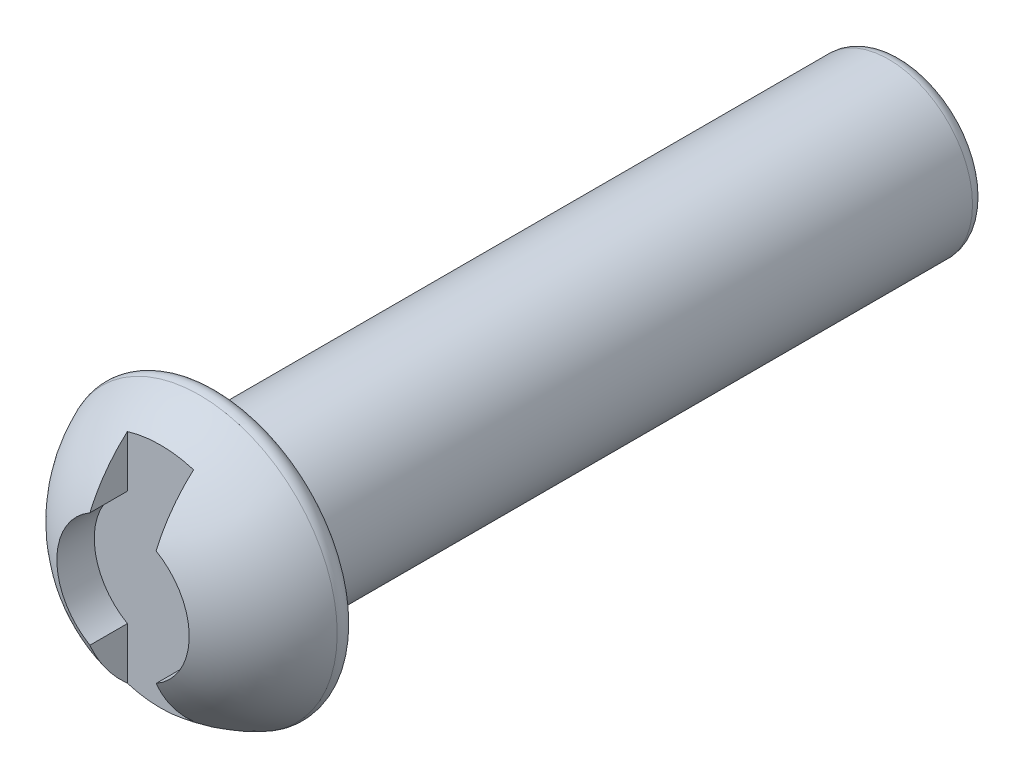
ISO-10303-21;
HEADER;
FILE_DESCRIPTION(('STEP AP214'),'2;1');
FILE_NAME('part.step','',(''),(''),'','','');
FILE_SCHEMA(('AUTOMOTIVE_DESIGN { 1 0 10303 214 1 1 1 1 }'));
ENDSEC;
DATA;
#1=APPLICATION_CONTEXT('core data for automotive mechanical design processes');
#2=APPLICATION_PROTOCOL_DEFINITION('international standard','automotive_design',2000,#1);
#3=PRODUCT_CONTEXT('',#1,'mechanical');
#4=PRODUCT('Part','Part','',(#3));
#5=PRODUCT_RELATED_PRODUCT_CATEGORY('part','',(#4));
#6=PRODUCT_DEFINITION_FORMATION('','',#4);
#7=PRODUCT_DEFINITION_CONTEXT('part definition',#1,'design');
#8=PRODUCT_DEFINITION('design','',#6,#7);
#9=PRODUCT_DEFINITION_SHAPE('','',#8);
#10=(LENGTH_UNIT() NAMED_UNIT(*) SI_UNIT(.MILLI.,.METRE.));
#11=(NAMED_UNIT(*) PLANE_ANGLE_UNIT() SI_UNIT($,.RADIAN.));
#12=(NAMED_UNIT(*) SI_UNIT($,.STERADIAN.) SOLID_ANGLE_UNIT());
#13=UNCERTAINTY_MEASURE_WITH_UNIT(LENGTH_MEASURE(1.E-05),#10,'distance_accuracy_value','');
#14=(GEOMETRIC_REPRESENTATION_CONTEXT(3) GLOBAL_UNCERTAINTY_ASSIGNED_CONTEXT((#13)) GLOBAL_UNIT_ASSIGNED_CONTEXT((#10,
#11,#12)) REPRESENTATION_CONTEXT('',''));
#15=CARTESIAN_POINT('',(0.,0.,0.));
#16=DIRECTION('',(0.,0.,1.));
#17=DIRECTION('',(1.,0.,0.));
#18=AXIS2_PLACEMENT_3D('',#15,#16,#17);
#19=CARTESIAN_POINT('',(0.,0.,-1.68776));
#20=DIRECTION('',(0.,0.,1.));
#21=DIRECTION('',(0.,1.,0.));
#22=AXIS2_PLACEMENT_3D('',#19,#20,#21);
#23=SPHERICAL_SURFACE('',#22,1.68776);
#24=CARTESIAN_POINT('',(0.,0.,-1.04266725626886));
#25=DIRECTION('',(0.,0.,-1.));
#26=DIRECTION('',(-1.,0.,0.));
#27=AXIS2_PLACEMENT_3D('',#24,#25,#26);
#28=CIRCLE('',#27,1.55961186504381);
#29=CARTESIAN_POINT('',(-1.55961186504381,0.,-1.04266725626886));
#30=VERTEX_POINT('',#29);
#31=EDGE_CURVE('E145',#30,#30,#28,.F.);
#32=ORIENTED_EDGE('',*,*,#31,.T.);
#33=EDGE_LOOP('',(#32));
#34=FACE_BOUND('',#33,.T.);
#35=CARTESIAN_POINT('',(-0.375,0.,-1.68776));
#36=DIRECTION('',(-1.,0.,0.));
#37=DIRECTION('',(0.,-1.,0.));
#38=AXIS2_PLACEMENT_3D('',#35,#36,#37);
#39=CIRCLE('',#38,1.64557248931793);
#40=CARTESIAN_POINT('',(-0.375,-1.2347821670238,-0.6));
#41=VERTEX_POINT('',#40);
#42=CARTESIAN_POINT('',(-0.375,-0.649519052838329,-0.175796436417861));
#43=VERTEX_POINT('',#42);
#44=EDGE_CURVE('E138',#41,#43,#39,.T.);
#45=ORIENTED_EDGE('',*,*,#44,.T.);
#46=CARTESIAN_POINT('',(0.,0.,-0.175796436417861));
#47=DIRECTION('',(0.,0.,-1.));
#48=DIRECTION('',(-1.,0.,0.));
#49=AXIS2_PLACEMENT_3D('',#46,#47,#48);
#50=CIRCLE('',#49,0.75);
#51=CARTESIAN_POINT('',(-0.375,0.64951905283833,-0.175796436417862));
#52=VERTEX_POINT('',#51);
#53=EDGE_CURVE('E60',#43,#52,#50,.T.);
#54=ORIENTED_EDGE('',*,*,#53,.T.);
#55=CARTESIAN_POINT('',(-0.375,0.,-1.68776));
#56=DIRECTION('',(-1.,0.,0.));
#57=DIRECTION('',(0.,-1.,0.));
#58=AXIS2_PLACEMENT_3D('',#55,#56,#57);
#59=CIRCLE('',#58,1.64557248931793);
#60=CARTESIAN_POINT('',(-0.375,1.2347821670238,-0.6));
#61=VERTEX_POINT('',#60);
#62=EDGE_CURVE('E141',#52,#61,#59,.T.);
#63=ORIENTED_EDGE('',*,*,#62,.T.);
#64=CARTESIAN_POINT('',(0.,0.,-0.6));
#65=DIRECTION('',(0.,0.,1.));
#66=DIRECTION('',(1.,0.,0.));
#67=AXIS2_PLACEMENT_3D('',#64,#65,#66);
#68=CIRCLE('',#67,1.29046968193755);
#69=CARTESIAN_POINT('',(0.375,1.2347821670238,-0.6));
#70=VERTEX_POINT('',#69);
#71=EDGE_CURVE('E131',#70,#61,#68,.T.);
#72=ORIENTED_EDGE('',*,*,#71,.F.);
#73=CARTESIAN_POINT('',(0.375,0.,-1.68776));
#74=DIRECTION('',(1.,0.,0.));
#75=DIRECTION('',(0.,1.,0.));
#76=AXIS2_PLACEMENT_3D('',#73,#74,#75);
#77=CIRCLE('',#76,1.64557248931793);
#78=CARTESIAN_POINT('',(0.375,0.64951905283833,-0.175796436417861));
#79=VERTEX_POINT('',#78);
#80=EDGE_CURVE('E135',#70,#79,#77,.T.);
#81=ORIENTED_EDGE('',*,*,#80,.T.);
#82=CARTESIAN_POINT('',(0.,0.,-0.175796436417861));
#83=DIRECTION('',(0.,0.,-1.));
#84=DIRECTION('',(-1.,0.,0.));
#85=AXIS2_PLACEMENT_3D('',#82,#83,#84);
#86=CIRCLE('',#85,0.75);
#87=CARTESIAN_POINT('',(0.375,-0.649519052838329,-0.175796436417861));
#88=VERTEX_POINT('',#87);
#89=EDGE_CURVE('E133',#79,#88,#86,.T.);
#90=ORIENTED_EDGE('',*,*,#89,.T.);
#91=CARTESIAN_POINT('',(0.375,0.,-1.68776));
#92=DIRECTION('',(1.,0.,0.));
#93=DIRECTION('',(0.,1.,0.));
#94=AXIS2_PLACEMENT_3D('',#91,#92,#93);
#95=CIRCLE('',#94,1.64557248931793);
#96=CARTESIAN_POINT('',(0.375,-1.2347821670238,-0.6));
#97=VERTEX_POINT('',#96);
#98=EDGE_CURVE('E105',#88,#97,#95,.T.);
#99=ORIENTED_EDGE('',*,*,#98,.T.);
#100=EDGE_CURVE('E98',#41,#97,#68,.T.);
#101=ORIENTED_EDGE('',*,*,#100,.F.);
#102=EDGE_LOOP('',(#45,#54,#63,#72,#81,#90,#99,#101));
#103=FACE_BOUND('',#102,.T.);
#104=ADVANCED_FACE('F37',(#34,#103),#23,.T.);
#105=CARTESIAN_POINT('',(0.,0.,-9.));
#106=DIRECTION('',(0.,0.,1.));
#107=DIRECTION('',(1.,0.,0.));
#108=AXIS2_PLACEMENT_3D('',#105,#106,#107);
#109=PLANE('',#108);
#110=CARTESIAN_POINT('',(0.,0.,-9.));
#111=DIRECTION('',(0.,0.,1.));
#112=DIRECTION('',(1.,0.,0.));
#113=AXIS2_PLACEMENT_3D('',#110,#111,#112);
#114=CIRCLE('',#113,0.799999999999999);
#115=CARTESIAN_POINT('',(0.799999999999999,0.,-9.));
#116=VERTEX_POINT('',#115);
#117=EDGE_CURVE('E11',#116,#116,#114,.F.);
#118=ORIENTED_EDGE('',*,*,#117,.T.);
#119=EDGE_LOOP('',(#118));
#120=FACE_BOUND('',#119,.T.);
#121=ADVANCED_FACE('F165',(#120),#109,.F.);
#122=CARTESIAN_POINT('',(0.,0.,0.));
#123=DIRECTION('',(0.,0.,1.));
#124=DIRECTION('',(1.,0.,0.));
#125=AXIS2_PLACEMENT_3D('',#122,#123,#124);
#126=CYLINDRICAL_SURFACE('',#125,0.949999999999999);
#127=CARTESIAN_POINT('',(0.,0.,-8.85));
#128=DIRECTION('',(0.,0.,1.));
#129=DIRECTION('',(1.,0.,0.));
#130=AXIS2_PLACEMENT_3D('',#127,#128,#129);
#131=CIRCLE('',#130,0.949999999999999);
#132=CARTESIAN_POINT('',(0.949999999999999,0.,-8.85));
#133=VERTEX_POINT('',#132);
#134=EDGE_CURVE('E45',#133,#133,#131,.T.);
#135=ORIENTED_EDGE('',*,*,#134,.T.);
#136=EDGE_LOOP('',(#135));
#137=FACE_BOUND('',#136,.T.);
#138=CARTESIAN_POINT('',(0.,0.,-1.25));
#139=DIRECTION('',(0.,0.,1.));
#140=DIRECTION('',(1.,0.,0.));
#141=AXIS2_PLACEMENT_3D('',#138,#139,#140);
#142=CIRCLE('',#141,0.949999999999999);
#143=CARTESIAN_POINT('',(0.949999999999999,0.,-1.25));
#144=VERTEX_POINT('',#143);
#145=EDGE_CURVE('E124',#144,#144,#142,.T.);
#146=ORIENTED_EDGE('',*,*,#145,.F.);
#147=EDGE_LOOP('',(#146));
#148=FACE_BOUND('',#147,.T.);
#149=ADVANCED_FACE('F153',(#137,#148),#126,.T.);
#150=CARTESIAN_POINT('',(0.,1.63,-1.25));
#151=DIRECTION('',(0.,0.,1.));
#152=DIRECTION('',(1.,0.,0.));
#153=AXIS2_PLACEMENT_3D('',#150,#151,#152);
#154=PLANE('',#153);
#155=CARTESIAN_POINT('',(0.,0.,-1.25));
#156=DIRECTION('',(0.,0.,1.));
#157=DIRECTION('',(1.,0.,0.));
#158=AXIS2_PLACEMENT_3D('',#155,#156,#157);
#159=CIRCLE('',#158,1.42100105559426);
#160=CARTESIAN_POINT('',(1.42100105559426,0.,-1.25));
#161=VERTEX_POINT('',#160);
#162=EDGE_CURVE('E148',#161,#161,#159,.F.);
#163=ORIENTED_EDGE('',*,*,#162,.T.);
#164=EDGE_LOOP('',(#163));
#165=FACE_BOUND('',#164,.T.);
#166=ORIENTED_EDGE('',*,*,#145,.T.);
#167=EDGE_LOOP('',(#166));
#168=FACE_BOUND('',#167,.T.);
#169=ADVANCED_FACE('F178',(#165,#168),#154,.F.);
#170=CARTESIAN_POINT('',(-0.375,-0.649519052838329,-0.6));
#171=DIRECTION('',(-1.,0.,0.));
#172=DIRECTION('',(0.,-1.,0.));
#173=AXIS2_PLACEMENT_3D('',#170,#171,#172);
#174=PLANE('',#173);
#175=DIRECTION('',(0.,-1.,0.));
#176=VECTOR('',#175,1.);
#177=CARTESIAN_POINT('',(-0.375,-0.649519052838329,-0.6));
#178=LINE('',#177,#176);
#179=CARTESIAN_POINT('',(-0.375,-0.649519052838329,-0.6));
#180=VERTEX_POINT('',#179);
#181=EDGE_CURVE('E52',#180,#41,#178,.T.);
#182=ORIENTED_EDGE('',*,*,#181,.F.);
#183=DIRECTION('',(0.,0.,1.));
#184=VECTOR('',#183,1.);
#185=CARTESIAN_POINT('',(-0.375,-0.649519052838329,-0.6));
#186=LINE('',#185,#184);
#187=EDGE_CURVE('E122',#180,#43,#186,.T.);
#188=ORIENTED_EDGE('',*,*,#187,.T.);
#189=ORIENTED_EDGE('',*,*,#44,.F.);
#190=EDGE_LOOP('',(#182,#188,#189));
#191=FACE_BOUND('',#190,.T.);
#192=ADVANCED_FACE('F181',(#191),#174,.F.);
#193=CARTESIAN_POINT('',(0.,0.,-0.6));
#194=DIRECTION('',(0.,0.,1.));
#195=DIRECTION('',(1.,0.,0.));
#196=AXIS2_PLACEMENT_3D('',#193,#194,#195);
#197=CYLINDRICAL_SURFACE('',#196,0.75);
#198=ORIENTED_EDGE('',*,*,#187,.F.);
#199=CARTESIAN_POINT('',(0.,0.,-0.6));
#200=DIRECTION('',(0.,0.,1.));
#201=DIRECTION('',(1.,0.,0.));
#202=AXIS2_PLACEMENT_3D('',#199,#200,#201);
#203=CIRCLE('',#202,0.75);
#204=CARTESIAN_POINT('',(-0.375,0.64951905283833,-0.6));
#205=VERTEX_POINT('',#204);
#206=EDGE_CURVE('E119',#205,#180,#203,.T.);
#207=ORIENTED_EDGE('',*,*,#206,.F.);
#208=DIRECTION('',(0.,0.,1.));
#209=VECTOR('',#208,1.);
#210=CARTESIAN_POINT('',(-0.375,0.64951905283833,-0.6));
#211=LINE('',#210,#209);
#212=EDGE_CURVE('E125',#205,#52,#211,.T.);
#213=ORIENTED_EDGE('',*,*,#212,.T.);
#214=ORIENTED_EDGE('',*,*,#53,.F.);
#215=EDGE_LOOP('',(#198,#207,#213,#214));
#216=FACE_BOUND('',#215,.T.);
#217=ADVANCED_FACE('F194',(#216),#197,.F.);
#218=CARTESIAN_POINT('',(-0.375,1.87097888013581,-0.6));
#219=DIRECTION('',(-1.,0.,0.));
#220=DIRECTION('',(0.,-1.,0.));
#221=AXIS2_PLACEMENT_3D('',#218,#219,#220);
#222=PLANE('',#221);
#223=ORIENTED_EDGE('',*,*,#212,.F.);
#224=DIRECTION('',(0.,-1.,0.));
#225=VECTOR('',#224,1.);
#226=CARTESIAN_POINT('',(-0.375,1.87097888013581,-0.6));
#227=LINE('',#226,#225);
#228=EDGE_CURVE('E115',#61,#205,#227,.T.);
#229=ORIENTED_EDGE('',*,*,#228,.F.);
#230=ORIENTED_EDGE('',*,*,#62,.F.);
#231=EDGE_LOOP('',(#223,#229,#230));
#232=FACE_BOUND('',#231,.T.);
#233=ADVANCED_FACE('F190',(#232),#222,.F.);
#234=CARTESIAN_POINT('',(0.375,1.87097888013581,-0.6));
#235=DIRECTION('',(1.,0.,0.));
#236=DIRECTION('',(0.,1.,0.));
#237=AXIS2_PLACEMENT_3D('',#234,#235,#236);
#238=PLANE('',#237);
#239=DIRECTION('',(0.,1.,0.));
#240=VECTOR('',#239,1.);
#241=CARTESIAN_POINT('',(0.375,1.87097888013581,-0.6));
#242=LINE('',#241,#240);
#243=CARTESIAN_POINT('',(0.375,0.64951905283833,-0.6));
#244=VERTEX_POINT('',#243);
#245=EDGE_CURVE('E113',#244,#70,#242,.T.);
#246=ORIENTED_EDGE('',*,*,#245,.F.);
#247=DIRECTION('',(0.,0.,1.));
#248=VECTOR('',#247,1.);
#249=CARTESIAN_POINT('',(0.375,0.64951905283833,-0.6));
#250=LINE('',#249,#248);
#251=EDGE_CURVE('E108',#244,#79,#250,.T.);
#252=ORIENTED_EDGE('',*,*,#251,.T.);
#253=ORIENTED_EDGE('',*,*,#80,.F.);
#254=EDGE_LOOP('',(#246,#252,#253));
#255=FACE_BOUND('',#254,.T.);
#256=ADVANCED_FACE('F187',(#255),#238,.F.);
#257=CARTESIAN_POINT('',(0.,0.,-0.6));
#258=DIRECTION('',(0.,0.,1.));
#259=DIRECTION('',(1.,0.,0.));
#260=AXIS2_PLACEMENT_3D('',#257,#258,#259);
#261=CYLINDRICAL_SURFACE('',#260,0.75);
#262=ORIENTED_EDGE('',*,*,#251,.F.);
#263=CARTESIAN_POINT('',(0.,0.,-0.6));
#264=DIRECTION('',(0.,0.,1.));
#265=DIRECTION('',(1.,0.,0.));
#266=AXIS2_PLACEMENT_3D('',#263,#264,#265);
#267=CIRCLE('',#266,0.75);
#268=CARTESIAN_POINT('',(0.375,-0.649519052838329,-0.6));
#269=VERTEX_POINT('',#268);
#270=EDGE_CURVE('E96',#269,#244,#267,.T.);
#271=ORIENTED_EDGE('',*,*,#270,.F.);
#272=DIRECTION('',(0.,0.,1.));
#273=VECTOR('',#272,1.);
#274=CARTESIAN_POINT('',(0.375,-0.649519052838329,-0.6));
#275=LINE('',#274,#273);
#276=EDGE_CURVE('E103',#269,#88,#275,.T.);
#277=ORIENTED_EDGE('',*,*,#276,.T.);
#278=ORIENTED_EDGE('',*,*,#89,.F.);
#279=EDGE_LOOP('',(#262,#271,#277,#278));
#280=FACE_BOUND('',#279,.T.);
#281=ADVANCED_FACE('F110',(#280),#261,.F.);
#282=CARTESIAN_POINT('',(0.375,-0.649519052838329,-0.6));
#283=DIRECTION('',(1.,0.,0.));
#284=DIRECTION('',(0.,1.,0.));
#285=AXIS2_PLACEMENT_3D('',#282,#283,#284);
#286=PLANE('',#285);
#287=ORIENTED_EDGE('',*,*,#276,.F.);
#288=DIRECTION('',(0.,1.,0.));
#289=VECTOR('',#288,1.);
#290=CARTESIAN_POINT('',(0.375,-0.649519052838329,-0.6));
#291=LINE('',#290,#289);
#292=EDGE_CURVE('E91',#97,#269,#291,.T.);
#293=ORIENTED_EDGE('',*,*,#292,.F.);
#294=ORIENTED_EDGE('',*,*,#98,.F.);
#295=EDGE_LOOP('',(#287,#293,#294));
#296=FACE_BOUND('',#295,.T.);
#297=ADVANCED_FACE('F104',(#296),#286,.F.);
#298=CARTESIAN_POINT('',(0.,0.,-0.6));
#299=DIRECTION('',(0.,0.,1.));
#300=DIRECTION('',(1.,0.,0.));
#301=AXIS2_PLACEMENT_3D('',#298,#299,#300);
#302=PLANE('',#301);
#303=ORIENTED_EDGE('',*,*,#71,.T.);
#304=ORIENTED_EDGE('',*,*,#228,.T.);
#305=ORIENTED_EDGE('',*,*,#206,.T.);
#306=ORIENTED_EDGE('',*,*,#181,.T.);
#307=ORIENTED_EDGE('',*,*,#100,.T.);
#308=ORIENTED_EDGE('',*,*,#292,.T.);
#309=ORIENTED_EDGE('',*,*,#270,.T.);
#310=ORIENTED_EDGE('',*,*,#245,.T.);
#311=EDGE_LOOP('',(#303,#304,#305,#306,#307,#308,#309,#310));
#312=FACE_BOUND('',#311,.T.);
#313=ADVANCED_FACE('F93',(#312),#302,.T.);
#314=CARTESIAN_POINT('',(0.,0.,-1.1));
#315=DIRECTION('',(0.,0.,1.));
#316=DIRECTION('',(1.,0.,0.));
#317=AXIS2_PLACEMENT_3D('',#314,#315,#316);
#318=TOROIDAL_SURFACE('',#317,1.42100105559426,0.15);
#319=ORIENTED_EDGE('',*,*,#162,.F.);
#320=EDGE_LOOP('',(#319));
#321=FACE_BOUND('',#320,.T.);
#322=ORIENTED_EDGE('',*,*,#31,.F.);
#323=EDGE_LOOP('',(#322));
#324=FACE_BOUND('',#323,.T.);
#325=ADVANCED_FACE('F157',(#321,#324),#318,.T.);
#326=CARTESIAN_POINT('',(0.,0.,-8.85));
#327=DIRECTION('',(0.,0.,1.));
#328=DIRECTION('',(1.,0.,0.));
#329=AXIS2_PLACEMENT_3D('',#326,#327,#328);
#330=TOROIDAL_SURFACE('',#329,0.799999999999999,0.15);
#331=ORIENTED_EDGE('',*,*,#117,.F.);
#332=EDGE_LOOP('',(#331));
#333=FACE_BOUND('',#332,.T.);
#334=ORIENTED_EDGE('',*,*,#134,.F.);
#335=EDGE_LOOP('',(#334));
#336=FACE_BOUND('',#335,.T.);
#337=ADVANCED_FACE('F39',(#333,#336),#330,.T.);
#338=CLOSED_SHELL('',(#104,#121,#149,#169,#192,#217,#233,#256,#281,#297,#313,#325,#337));
#339=MANIFOLD_SOLID_BREP('B2',#338);
#340=ADVANCED_BREP_SHAPE_REPRESENTATION('',(#18,#339),#14);
#341=SHAPE_DEFINITION_REPRESENTATION(#9,#340);
ENDSEC;
END-ISO-10303-21;
